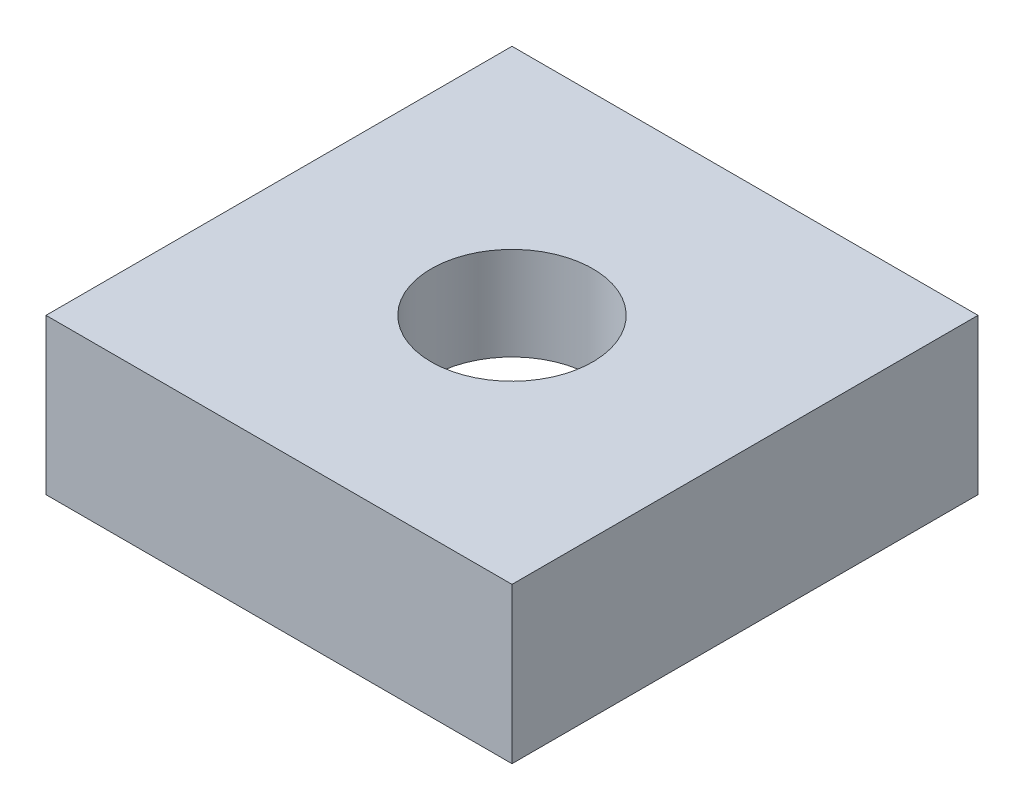
ISO-10303-21;
HEADER;
FILE_DESCRIPTION(('STEP AP214'),'2;1');
FILE_NAME('part.step','',(''),(''),'','','');
FILE_SCHEMA(('AUTOMOTIVE_DESIGN { 1 0 10303 214 1 1 1 1 }'));
ENDSEC;
DATA;
#1=APPLICATION_CONTEXT('core data for automotive mechanical design processes');
#2=APPLICATION_PROTOCOL_DEFINITION('international standard','automotive_design',2000,#1);
#3=PRODUCT_CONTEXT('',#1,'mechanical');
#4=PRODUCT('Part','Part','',(#3));
#5=PRODUCT_RELATED_PRODUCT_CATEGORY('part','',(#4));
#6=PRODUCT_DEFINITION_FORMATION('','',#4);
#7=PRODUCT_DEFINITION_CONTEXT('part definition',#1,'design');
#8=PRODUCT_DEFINITION('design','',#6,#7);
#9=PRODUCT_DEFINITION_SHAPE('','',#8);
#10=(LENGTH_UNIT() NAMED_UNIT(*) SI_UNIT(.MILLI.,.METRE.));
#11=(NAMED_UNIT(*) PLANE_ANGLE_UNIT() SI_UNIT($,.RADIAN.));
#12=(NAMED_UNIT(*) SI_UNIT($,.STERADIAN.) SOLID_ANGLE_UNIT());
#13=UNCERTAINTY_MEASURE_WITH_UNIT(LENGTH_MEASURE(1.E-05),#10,'distance_accuracy_value','');
#14=(GEOMETRIC_REPRESENTATION_CONTEXT(3) GLOBAL_UNCERTAINTY_ASSIGNED_CONTEXT((#13)) GLOBAL_UNIT_ASSIGNED_CONTEXT((#10,
#11,#12)) REPRESENTATION_CONTEXT('',''));
#15=CARTESIAN_POINT('',(0.,0.,0.));
#16=DIRECTION('',(0.,0.,1.));
#17=DIRECTION('',(1.,0.,0.));
#18=AXIS2_PLACEMENT_3D('',#15,#16,#17);
#19=CARTESIAN_POINT('',(0.,5.,0.));
#20=DIRECTION('',(1.,0.,0.));
#21=DIRECTION('',(0.,0.,-1.));
#22=AXIS2_PLACEMENT_3D('',#19,#20,#21);
#23=PLANE('',#22);
#24=DIRECTION('',(0.,0.,-1.));
#25=VECTOR('',#24,1.);
#26=CARTESIAN_POINT('',(0.,2.,-15.));
#27=LINE('',#26,#25);
#28=CARTESIAN_POINT('',(0.,2.,-2.5));
#29=VERTEX_POINT('',#28);
#30=CARTESIAN_POINT('',(0.,2.,-15.));
#31=VERTEX_POINT('',#30);
#32=EDGE_CURVE('E104',#29,#31,#27,.T.);
#33=ORIENTED_EDGE('',*,*,#32,.F.);
#34=DIRECTION('',(0.,-1.,0.));
#35=VECTOR('',#34,1.);
#36=CARTESIAN_POINT('',(0.,2.,-2.5));
#37=LINE('',#36,#35);
#38=CARTESIAN_POINT('',(0.,0.,-2.5));
#39=VERTEX_POINT('',#38);
#40=EDGE_CURVE('E157',#29,#39,#37,.T.);
#41=ORIENTED_EDGE('',*,*,#40,.T.);
#42=DIRECTION('',(0.,0.,1.));
#43=VECTOR('',#42,1.);
#44=CARTESIAN_POINT('',(0.,0.,0.));
#45=LINE('',#44,#43);
#46=CARTESIAN_POINT('',(0.,0.,0.));
#47=VERTEX_POINT('',#46);
#48=EDGE_CURVE('E144',#39,#47,#45,.T.);
#49=ORIENTED_EDGE('',*,*,#48,.T.);
#50=DIRECTION('',(0.,-1.,0.));
#51=VECTOR('',#50,1.);
#52=CARTESIAN_POINT('',(0.,5.,0.));
#53=LINE('',#52,#51);
#54=CARTESIAN_POINT('',(0.,5.,0.));
#55=VERTEX_POINT('',#54);
#56=EDGE_CURVE('E11',#55,#47,#53,.T.);
#57=ORIENTED_EDGE('',*,*,#56,.F.);
#58=DIRECTION('',(0.,0.,1.));
#59=VECTOR('',#58,1.);
#60=CARTESIAN_POINT('',(0.,5.,0.));
#61=LINE('',#60,#59);
#62=CARTESIAN_POINT('',(0.,5.,-15.));
#63=VERTEX_POINT('',#62);
#64=EDGE_CURVE('E125',#63,#55,#61,.T.);
#65=ORIENTED_EDGE('',*,*,#64,.F.);
#66=DIRECTION('',(0.,-1.,0.));
#67=VECTOR('',#66,1.);
#68=CARTESIAN_POINT('',(0.,5.,-15.));
#69=LINE('',#68,#67);
#70=EDGE_CURVE('E120',#63,#31,#69,.T.);
#71=ORIENTED_EDGE('',*,*,#70,.T.);
#72=EDGE_LOOP('',(#33,#41,#49,#57,#65,#71));
#73=FACE_BOUND('',#72,.T.);
#74=ADVANCED_FACE('F33',(#73),#23,.F.);
#75=CARTESIAN_POINT('',(0.,5.,0.));
#76=DIRECTION('',(0.,0.,-1.));
#77=DIRECTION('',(-1.,0.,0.));
#78=AXIS2_PLACEMENT_3D('',#75,#76,#77);
#79=PLANE('',#78);
#80=DIRECTION('',(1.,0.,0.));
#81=VECTOR('',#80,1.);
#82=CARTESIAN_POINT('',(0.,0.,0.));
#83=LINE('',#82,#81);
#84=CARTESIAN_POINT('',(15.,0.,0.));
#85=VERTEX_POINT('',#84);
#86=EDGE_CURVE('E143',#47,#85,#83,.T.);
#87=ORIENTED_EDGE('',*,*,#86,.T.);
#88=DIRECTION('',(0.,-1.,0.));
#89=VECTOR('',#88,1.);
#90=CARTESIAN_POINT('',(15.,5.,0.));
#91=LINE('',#90,#89);
#92=CARTESIAN_POINT('',(15.,5.,0.));
#93=VERTEX_POINT('',#92);
#94=EDGE_CURVE('E41',#93,#85,#91,.T.);
#95=ORIENTED_EDGE('',*,*,#94,.F.);
#96=DIRECTION('',(1.,0.,0.));
#97=VECTOR('',#96,1.);
#98=CARTESIAN_POINT('',(0.,5.,0.));
#99=LINE('',#98,#97);
#100=EDGE_CURVE('E83',#55,#93,#99,.T.);
#101=ORIENTED_EDGE('',*,*,#100,.F.);
#102=ORIENTED_EDGE('',*,*,#56,.T.);
#103=EDGE_LOOP('',(#87,#95,#101,#102));
#104=FACE_BOUND('',#103,.T.);
#105=ADVANCED_FACE('F174',(#104),#79,.F.);
#106=CARTESIAN_POINT('',(15.,5.,0.));
#107=DIRECTION('',(-1.,0.,0.));
#108=DIRECTION('',(0.,0.,1.));
#109=AXIS2_PLACEMENT_3D('',#106,#107,#108);
#110=PLANE('',#109);
#111=DIRECTION('',(0.,0.,-1.));
#112=VECTOR('',#111,1.);
#113=CARTESIAN_POINT('',(15.,0.,0.));
#114=LINE('',#113,#112);
#115=CARTESIAN_POINT('',(15.,0.,-15.));
#116=VERTEX_POINT('',#115);
#117=EDGE_CURVE('E76',#85,#116,#114,.T.);
#118=ORIENTED_EDGE('',*,*,#117,.T.);
#119=DIRECTION('',(0.,-1.,0.));
#120=VECTOR('',#119,1.);
#121=CARTESIAN_POINT('',(15.,5.,-15.));
#122=LINE('',#121,#120);
#123=CARTESIAN_POINT('',(15.,5.,-15.));
#124=VERTEX_POINT('',#123);
#125=EDGE_CURVE('E126',#124,#116,#122,.T.);
#126=ORIENTED_EDGE('',*,*,#125,.F.);
#127=DIRECTION('',(0.,0.,-1.));
#128=VECTOR('',#127,1.);
#129=CARTESIAN_POINT('',(15.,5.,0.));
#130=LINE('',#129,#128);
#131=EDGE_CURVE('E129',#93,#124,#130,.T.);
#132=ORIENTED_EDGE('',*,*,#131,.F.);
#133=ORIENTED_EDGE('',*,*,#94,.T.);
#134=EDGE_LOOP('',(#118,#126,#132,#133));
#135=FACE_BOUND('',#134,.T.);
#136=ADVANCED_FACE('F136',(#135),#110,.F.);
#137=CARTESIAN_POINT('',(0.,5.,-15.));
#138=DIRECTION('',(0.,0.,1.));
#139=DIRECTION('',(1.,0.,0.));
#140=AXIS2_PLACEMENT_3D('',#137,#138,#139);
#141=PLANE('',#140);
#142=DIRECTION('',(-1.,0.,0.));
#143=VECTOR('',#142,1.);
#144=CARTESIAN_POINT('',(0.,0.,-15.));
#145=LINE('',#144,#143);
#146=CARTESIAN_POINT('',(12.5,0.,-15.));
#147=VERTEX_POINT('',#146);
#148=EDGE_CURVE('E132',#116,#147,#145,.T.);
#149=ORIENTED_EDGE('',*,*,#148,.T.);
#150=DIRECTION('',(0.,-1.,0.));
#151=VECTOR('',#150,1.);
#152=CARTESIAN_POINT('',(12.5,2.,-15.));
#153=LINE('',#152,#151);
#154=CARTESIAN_POINT('',(12.5,2.,-15.));
#155=VERTEX_POINT('',#154);
#156=EDGE_CURVE('E48',#155,#147,#153,.T.);
#157=ORIENTED_EDGE('',*,*,#156,.F.);
#158=DIRECTION('',(1.,0.,0.));
#159=VECTOR('',#158,1.);
#160=CARTESIAN_POINT('',(0.,2.,-15.));
#161=LINE('',#160,#159);
#162=EDGE_CURVE('E109',#31,#155,#161,.T.);
#163=ORIENTED_EDGE('',*,*,#162,.F.);
#164=ORIENTED_EDGE('',*,*,#70,.F.);
#165=DIRECTION('',(-1.,0.,0.));
#166=VECTOR('',#165,1.);
#167=CARTESIAN_POINT('',(0.,5.,-15.));
#168=LINE('',#167,#166);
#169=EDGE_CURVE('E57',#124,#63,#168,.T.);
#170=ORIENTED_EDGE('',*,*,#169,.F.);
#171=ORIENTED_EDGE('',*,*,#125,.T.);
#172=EDGE_LOOP('',(#149,#157,#163,#164,#170,#171));
#173=FACE_BOUND('',#172,.T.);
#174=ADVANCED_FACE('F119',(#173),#141,.F.);
#175=CARTESIAN_POINT('',(0.,5.,0.));
#176=DIRECTION('',(0.,-1.,0.));
#177=DIRECTION('',(0.,0.,-1.));
#178=AXIS2_PLACEMENT_3D('',#175,#176,#177);
#179=PLANE('',#178);
#180=CARTESIAN_POINT('',(7.5,5.,-7.5));
#181=DIRECTION('',(0.,1.,0.));
#182=DIRECTION('',(0.,0.,1.));
#183=AXIS2_PLACEMENT_3D('',#180,#181,#182);
#184=CIRCLE('',#183,2.6);
#185=CARTESIAN_POINT('',(7.5,5.,-4.9));
#186=VERTEX_POINT('',#185);
#187=EDGE_CURVE('E147',#186,#186,#184,.T.);
#188=ORIENTED_EDGE('',*,*,#187,.F.);
#189=EDGE_LOOP('',(#188));
#190=FACE_BOUND('',#189,.T.);
#191=ORIENTED_EDGE('',*,*,#64,.T.);
#192=ORIENTED_EDGE('',*,*,#100,.T.);
#193=ORIENTED_EDGE('',*,*,#131,.T.);
#194=ORIENTED_EDGE('',*,*,#169,.T.);
#195=EDGE_LOOP('',(#191,#192,#193,#194));
#196=FACE_BOUND('',#195,.T.);
#197=ADVANCED_FACE('F185',(#190,#196),#179,.F.);
#198=CARTESIAN_POINT('',(0.,0.,0.));
#199=DIRECTION('',(0.,-1.,0.));
#200=DIRECTION('',(0.,0.,-1.));
#201=AXIS2_PLACEMENT_3D('',#198,#199,#200);
#202=PLANE('',#201);
#203=DIRECTION('',(-1.,0.,0.));
#204=VECTOR('',#203,1.);
#205=CARTESIAN_POINT('',(0.,0.,-2.5));
#206=LINE('',#205,#204);
#207=CARTESIAN_POINT('',(12.5,0.,-2.5));
#208=VERTEX_POINT('',#207);
#209=EDGE_CURVE('E115',#208,#39,#206,.T.);
#210=ORIENTED_EDGE('',*,*,#209,.F.);
#211=DIRECTION('',(0.,0.,1.));
#212=VECTOR('',#211,1.);
#213=CARTESIAN_POINT('',(12.5,0.,-15.));
#214=LINE('',#213,#212);
#215=EDGE_CURVE('E160',#147,#208,#214,.T.);
#216=ORIENTED_EDGE('',*,*,#215,.F.);
#217=ORIENTED_EDGE('',*,*,#148,.F.);
#218=ORIENTED_EDGE('',*,*,#117,.F.);
#219=ORIENTED_EDGE('',*,*,#86,.F.);
#220=ORIENTED_EDGE('',*,*,#48,.F.);
#221=EDGE_LOOP('',(#210,#216,#217,#218,#219,#220));
#222=FACE_BOUND('',#221,.T.);
#223=ADVANCED_FACE('F141',(#222),#202,.T.);
#224=CARTESIAN_POINT('',(7.5,0.,-7.5));
#225=DIRECTION('',(0.,1.,0.));
#226=DIRECTION('',(0.,0.,1.));
#227=AXIS2_PLACEMENT_3D('',#224,#225,#226);
#228=CYLINDRICAL_SURFACE('',#227,2.6);
#229=CARTESIAN_POINT('',(7.5,2.,-7.5));
#230=DIRECTION('',(0.,1.,0.));
#231=DIRECTION('',(0.,0.,1.));
#232=AXIS2_PLACEMENT_3D('',#229,#230,#231);
#233=CIRCLE('',#232,2.6);
#234=CARTESIAN_POINT('',(7.5,2.,-4.9));
#235=VERTEX_POINT('',#234);
#236=EDGE_CURVE('E36',#235,#235,#233,.F.);
#237=ORIENTED_EDGE('',*,*,#236,.T.);
#238=EDGE_LOOP('',(#237));
#239=FACE_BOUND('',#238,.T.);
#240=ORIENTED_EDGE('',*,*,#187,.T.);
#241=EDGE_LOOP('',(#240));
#242=FACE_BOUND('',#241,.T.);
#243=ADVANCED_FACE('F188',(#239,#242),#228,.F.);
#244=CARTESIAN_POINT('',(0.,2.,0.));
#245=DIRECTION('',(0.,1.,0.));
#246=DIRECTION('',(0.,0.,1.));
#247=AXIS2_PLACEMENT_3D('',#244,#245,#246);
#248=PLANE('',#247);
#249=ORIENTED_EDGE('',*,*,#32,.T.);
#250=ORIENTED_EDGE('',*,*,#162,.T.);
#251=DIRECTION('',(0.,0.,1.));
#252=VECTOR('',#251,1.);
#253=CARTESIAN_POINT('',(12.5,2.,-15.));
#254=LINE('',#253,#252);
#255=CARTESIAN_POINT('',(12.5,2.,-2.5));
#256=VERTEX_POINT('',#255);
#257=EDGE_CURVE('E122',#155,#256,#254,.T.);
#258=ORIENTED_EDGE('',*,*,#257,.T.);
#259=DIRECTION('',(-1.,0.,0.));
#260=VECTOR('',#259,1.);
#261=CARTESIAN_POINT('',(0.,2.,-2.5));
#262=LINE('',#261,#260);
#263=EDGE_CURVE('E111',#256,#29,#262,.T.);
#264=ORIENTED_EDGE('',*,*,#263,.T.);
#265=EDGE_LOOP('',(#249,#250,#258,#264));
#266=FACE_BOUND('',#265,.T.);
#267=ORIENTED_EDGE('',*,*,#236,.F.);
#268=EDGE_LOOP('',(#267));
#269=FACE_BOUND('',#268,.T.);
#270=ADVANCED_FACE('F106',(#266,#269),#248,.F.);
#271=CARTESIAN_POINT('',(0.,2.,-2.5));
#272=DIRECTION('',(0.,0.,1.));
#273=DIRECTION('',(1.,0.,0.));
#274=AXIS2_PLACEMENT_3D('',#271,#272,#273);
#275=PLANE('',#274);
#276=ORIENTED_EDGE('',*,*,#209,.T.);
#277=ORIENTED_EDGE('',*,*,#40,.F.);
#278=ORIENTED_EDGE('',*,*,#263,.F.);
#279=DIRECTION('',(0.,-1.,0.));
#280=VECTOR('',#279,1.);
#281=CARTESIAN_POINT('',(12.5,2.,-2.5));
#282=LINE('',#281,#280);
#283=EDGE_CURVE('E155',#256,#208,#282,.T.);
#284=ORIENTED_EDGE('',*,*,#283,.T.);
#285=EDGE_LOOP('',(#276,#277,#278,#284));
#286=FACE_BOUND('',#285,.T.);
#287=ADVANCED_FACE('F164',(#286),#275,.F.);
#288=CARTESIAN_POINT('',(12.5,2.,-15.));
#289=DIRECTION('',(1.,0.,0.));
#290=DIRECTION('',(0.,0.,-1.));
#291=AXIS2_PLACEMENT_3D('',#288,#289,#290);
#292=PLANE('',#291);
#293=ORIENTED_EDGE('',*,*,#215,.T.);
#294=ORIENTED_EDGE('',*,*,#283,.F.);
#295=ORIENTED_EDGE('',*,*,#257,.F.);
#296=ORIENTED_EDGE('',*,*,#156,.T.);
#297=EDGE_LOOP('',(#293,#294,#295,#296));
#298=FACE_BOUND('',#297,.T.);
#299=ADVANCED_FACE('F165',(#298),#292,.F.);
#300=CLOSED_SHELL('',(#74,#105,#136,#174,#197,#223,#243,#270,#287,#299));
#301=MANIFOLD_SOLID_BREP('B2',#300);
#302=ADVANCED_BREP_SHAPE_REPRESENTATION('',(#18,#301),#14);
#303=SHAPE_DEFINITION_REPRESENTATION(#9,#302);
ENDSEC;
END-ISO-10303-21;
